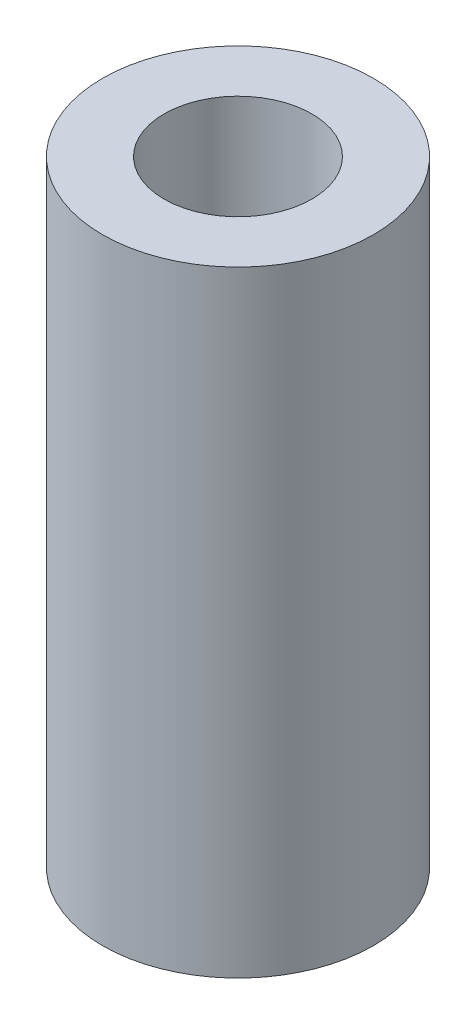
ISO-10303-21;
HEADER;
FILE_DESCRIPTION(('STEP AP214'),'2;1');
FILE_NAME('part.step','',(''),(''),'','','');
FILE_SCHEMA(('AUTOMOTIVE_DESIGN { 1 0 10303 214 1 1 1 1 }'));
ENDSEC;
DATA;
#1=APPLICATION_CONTEXT('core data for automotive mechanical design processes');
#2=APPLICATION_PROTOCOL_DEFINITION('international standard','automotive_design',2000,#1);
#3=PRODUCT_CONTEXT('',#1,'mechanical');
#4=PRODUCT('Part','Part','',(#3));
#5=PRODUCT_RELATED_PRODUCT_CATEGORY('part','',(#4));
#6=PRODUCT_DEFINITION_FORMATION('','',#4);
#7=PRODUCT_DEFINITION_CONTEXT('part definition',#1,'design');
#8=PRODUCT_DEFINITION('design','',#6,#7);
#9=PRODUCT_DEFINITION_SHAPE('','',#8);
#10=(LENGTH_UNIT() NAMED_UNIT(*) SI_UNIT(.MILLI.,.METRE.));
#11=(NAMED_UNIT(*) PLANE_ANGLE_UNIT() SI_UNIT($,.RADIAN.));
#12=(NAMED_UNIT(*) SI_UNIT($,.STERADIAN.) SOLID_ANGLE_UNIT());
#13=UNCERTAINTY_MEASURE_WITH_UNIT(LENGTH_MEASURE(1.E-05),#10,'distance_accuracy_value','');
#14=(GEOMETRIC_REPRESENTATION_CONTEXT(3) GLOBAL_UNCERTAINTY_ASSIGNED_CONTEXT((#13)) GLOBAL_UNIT_ASSIGNED_CONTEXT((#10,
#11,#12)) REPRESENTATION_CONTEXT('',''));
#15=CARTESIAN_POINT('',(0.,0.,0.));
#16=DIRECTION('',(0.,0.,1.));
#17=DIRECTION('',(1.,0.,0.));
#18=AXIS2_PLACEMENT_3D('',#15,#16,#17);
#19=CARTESIAN_POINT('',(0.,15.,0.));
#20=DIRECTION('',(0.,1.,0.));
#21=DIRECTION('',(0.,0.,1.));
#22=AXIS2_PLACEMENT_3D('',#19,#20,#21);
#23=PLANE('',#22);
#24=CARTESIAN_POINT('',(0.,15.,0.));
#25=DIRECTION('',(0.,1.,0.));
#26=DIRECTION('',(0.,0.,1.));
#27=AXIS2_PLACEMENT_3D('',#24,#25,#26);
#28=CIRCLE('',#27,3.3);
#29=CARTESIAN_POINT('',(0.,15.,3.3));
#30=VERTEX_POINT('',#29);
#31=EDGE_CURVE('E10',#30,#30,#28,.T.);
#32=ORIENTED_EDGE('',*,*,#31,.T.);
#33=EDGE_LOOP('',(#32));
#34=FACE_BOUND('',#33,.T.);
#35=CARTESIAN_POINT('',(0.,15.,0.));
#36=DIRECTION('',(0.,1.,0.));
#37=DIRECTION('',(0.,0.,1.));
#38=AXIS2_PLACEMENT_3D('',#35,#36,#37);
#39=CIRCLE('',#38,1.8);
#40=CARTESIAN_POINT('',(0.,15.,1.8));
#41=VERTEX_POINT('',#40);
#42=EDGE_CURVE('E42',#41,#41,#39,.T.);
#43=ORIENTED_EDGE('',*,*,#42,.F.);
#44=EDGE_LOOP('',(#43));
#45=FACE_BOUND('',#44,.T.);
#46=ADVANCED_FACE('F31',(#34,#45),#23,.T.);
#47=CARTESIAN_POINT('',(0.,0.,0.));
#48=DIRECTION('',(0.,1.,0.));
#49=DIRECTION('',(0.,0.,1.));
#50=AXIS2_PLACEMENT_3D('',#47,#48,#49);
#51=PLANE('',#50);
#52=CARTESIAN_POINT('',(0.,0.,0.));
#53=DIRECTION('',(0.,1.,0.));
#54=DIRECTION('',(0.,0.,1.));
#55=AXIS2_PLACEMENT_3D('',#52,#53,#54);
#56=CIRCLE('',#55,3.3);
#57=CARTESIAN_POINT('',(0.,0.,3.3));
#58=VERTEX_POINT('',#57);
#59=EDGE_CURVE('E35',#58,#58,#56,.T.);
#60=ORIENTED_EDGE('',*,*,#59,.F.);
#61=EDGE_LOOP('',(#60));
#62=FACE_BOUND('',#61,.T.);
#63=CARTESIAN_POINT('',(0.,0.,0.));
#64=DIRECTION('',(0.,1.,0.));
#65=DIRECTION('',(0.,0.,1.));
#66=AXIS2_PLACEMENT_3D('',#63,#64,#65);
#67=CIRCLE('',#66,1.8);
#68=CARTESIAN_POINT('',(0.,0.,1.8));
#69=VERTEX_POINT('',#68);
#70=EDGE_CURVE('E44',#69,#69,#67,.T.);
#71=ORIENTED_EDGE('',*,*,#70,.T.);
#72=EDGE_LOOP('',(#71));
#73=FACE_BOUND('',#72,.T.);
#74=ADVANCED_FACE('F54',(#62,#73),#51,.F.);
#75=CARTESIAN_POINT('',(0.,15.,0.));
#76=DIRECTION('',(0.,-1.,0.));
#77=DIRECTION('',(0.,0.,-1.));
#78=AXIS2_PLACEMENT_3D('',#75,#76,#77);
#79=CYLINDRICAL_SURFACE('',#78,3.3);
#80=ORIENTED_EDGE('',*,*,#31,.F.);
#81=EDGE_LOOP('',(#80));
#82=FACE_BOUND('',#81,.T.);
#83=ORIENTED_EDGE('',*,*,#59,.T.);
#84=EDGE_LOOP('',(#83));
#85=FACE_BOUND('',#84,.T.);
#86=ADVANCED_FACE('F33',(#82,#85),#79,.T.);
#87=CARTESIAN_POINT('',(0.,15.,0.));
#88=DIRECTION('',(0.,-1.,0.));
#89=DIRECTION('',(0.,0.,-1.));
#90=AXIS2_PLACEMENT_3D('',#87,#88,#89);
#91=CYLINDRICAL_SURFACE('',#90,1.8);
#92=ORIENTED_EDGE('',*,*,#42,.T.);
#93=EDGE_LOOP('',(#92));
#94=FACE_BOUND('',#93,.T.);
#95=ORIENTED_EDGE('',*,*,#70,.F.);
#96=EDGE_LOOP('',(#95));
#97=FACE_BOUND('',#96,.T.);
#98=ADVANCED_FACE('F50',(#94,#97),#91,.F.);
#99=CLOSED_SHELL('',(#46,#74,#86,#98));
#100=MANIFOLD_SOLID_BREP('B2',#99);
#101=ADVANCED_BREP_SHAPE_REPRESENTATION('',(#18,#100),#14);
#102=SHAPE_DEFINITION_REPRESENTATION(#9,#101);
ENDSEC;
END-ISO-10303-21;
